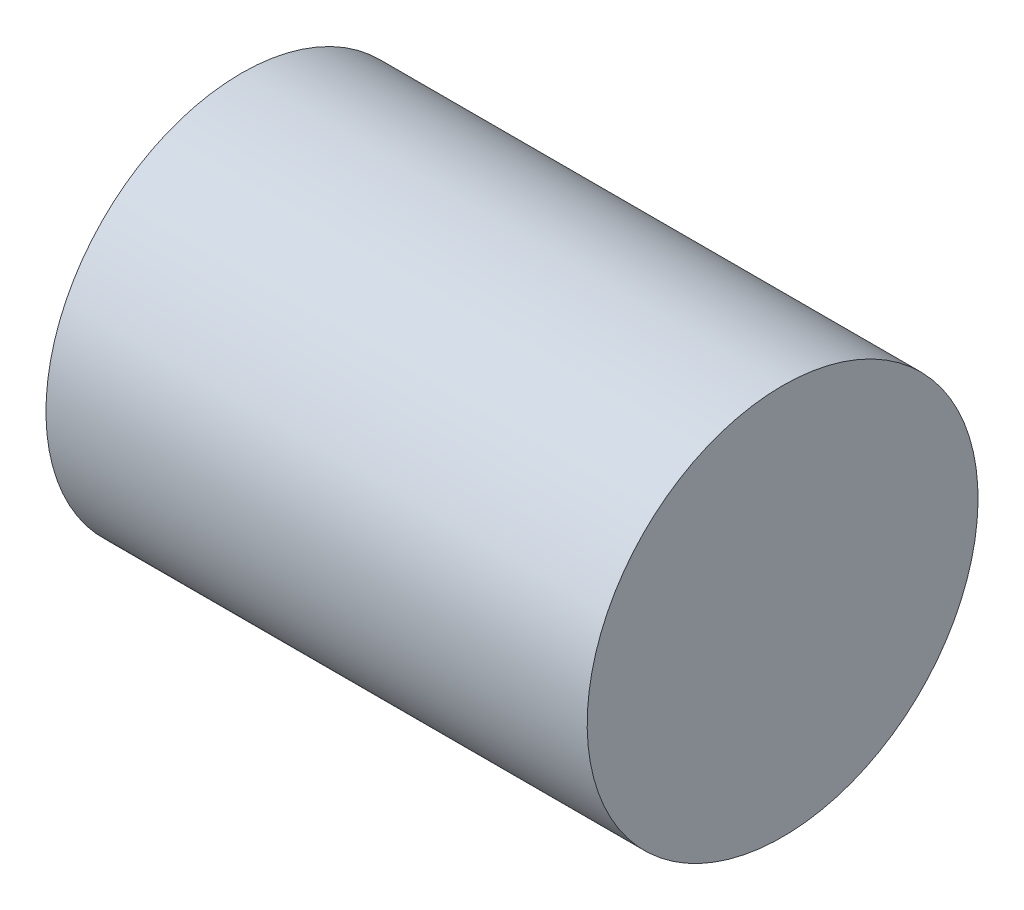
ISO-10303-21;
HEADER;
FILE_DESCRIPTION(('STEP AP214'),'2;1');
FILE_NAME('part.step','',(''),(''),'','','');
FILE_SCHEMA(('AUTOMOTIVE_DESIGN { 1 0 10303 214 1 1 1 1 }'));
ENDSEC;
DATA;
#1=APPLICATION_CONTEXT('core data for automotive mechanical design processes');
#2=APPLICATION_PROTOCOL_DEFINITION('international standard','automotive_design',2000,#1);
#3=PRODUCT_CONTEXT('',#1,'mechanical');
#4=PRODUCT('Part','Part','',(#3));
#5=PRODUCT_RELATED_PRODUCT_CATEGORY('part','',(#4));
#6=PRODUCT_DEFINITION_FORMATION('','',#4);
#7=PRODUCT_DEFINITION_CONTEXT('part definition',#1,'design');
#8=PRODUCT_DEFINITION('design','',#6,#7);
#9=PRODUCT_DEFINITION_SHAPE('','',#8);
#10=(LENGTH_UNIT() NAMED_UNIT(*) SI_UNIT(.MILLI.,.METRE.));
#11=(NAMED_UNIT(*) PLANE_ANGLE_UNIT() SI_UNIT($,.RADIAN.));
#12=(NAMED_UNIT(*) SI_UNIT($,.STERADIAN.) SOLID_ANGLE_UNIT());
#13=UNCERTAINTY_MEASURE_WITH_UNIT(LENGTH_MEASURE(1.E-05),#10,'distance_accuracy_value','');
#14=(GEOMETRIC_REPRESENTATION_CONTEXT(3) GLOBAL_UNCERTAINTY_ASSIGNED_CONTEXT((#13)) GLOBAL_UNIT_ASSIGNED_CONTEXT((#10,
#11,#12)) REPRESENTATION_CONTEXT('',''));
#15=CARTESIAN_POINT('',(0.,0.,0.));
#16=DIRECTION('',(0.,0.,1.));
#17=DIRECTION('',(1.,0.,0.));
#18=AXIS2_PLACEMENT_3D('',#15,#16,#17);
#19=CARTESIAN_POINT('',(0.,0.,0.));
#20=DIRECTION('',(-1.,0.,0.));
#21=DIRECTION('',(0.,-1.,0.));
#22=AXIS2_PLACEMENT_3D('',#19,#20,#21);
#23=PLANE('',#22);
#24=CARTESIAN_POINT('',(0.,0.,0.));
#25=DIRECTION('',(1.,0.,0.));
#26=DIRECTION('',(0.,1.,0.));
#27=AXIS2_PLACEMENT_3D('',#24,#25,#26);
#28=CIRCLE('',#27,65.);
#29=CARTESIAN_POINT('',(0.,65.,0.));
#30=VERTEX_POINT('',#29);
#31=EDGE_CURVE('E10',#30,#30,#28,.T.);
#32=ORIENTED_EDGE('',*,*,#31,.F.);
#33=EDGE_LOOP('',(#32));
#34=FACE_BOUND('',#33,.T.);
#35=ADVANCED_FACE('F37',(#34),#23,.T.);
#36=CARTESIAN_POINT('',(180.,0.,0.));
#37=DIRECTION('',(1.,0.,0.));
#38=DIRECTION('',(0.,1.,0.));
#39=AXIS2_PLACEMENT_3D('',#36,#37,#38);
#40=CYLINDRICAL_SURFACE('',#39,65.);
#41=ORIENTED_EDGE('',*,*,#31,.T.);
#42=EDGE_LOOP('',(#41));
#43=FACE_BOUND('',#42,.T.);
#44=CARTESIAN_POINT('',(180.,0.,0.));
#45=DIRECTION('',(1.,0.,0.));
#46=DIRECTION('',(0.,1.,0.));
#47=AXIS2_PLACEMENT_3D('',#44,#45,#46);
#48=CIRCLE('',#47,65.);
#49=CARTESIAN_POINT('',(180.,65.,0.));
#50=VERTEX_POINT('',#49);
#51=EDGE_CURVE('E44',#50,#50,#48,.T.);
#52=ORIENTED_EDGE('',*,*,#51,.F.);
#53=EDGE_LOOP('',(#52));
#54=FACE_BOUND('',#53,.T.);
#55=ADVANCED_FACE('F53',(#43,#54),#40,.T.);
#56=CARTESIAN_POINT('',(180.,65.,0.));
#57=DIRECTION('',(1.,0.,0.));
#58=DIRECTION('',(0.,1.,0.));
#59=AXIS2_PLACEMENT_3D('',#56,#57,#58);
#60=PLANE('',#59);
#61=ORIENTED_EDGE('',*,*,#51,.T.);
#62=EDGE_LOOP('',(#61));
#63=FACE_BOUND('',#62,.T.);
#64=ADVANCED_FACE('F51',(#63),#60,.T.);
#65=CLOSED_SHELL('',(#35,#55,#64));
#66=MANIFOLD_SOLID_BREP('B2',#65);
#67=ADVANCED_BREP_SHAPE_REPRESENTATION('',(#18,#66),#14);
#68=SHAPE_DEFINITION_REPRESENTATION(#9,#67);
ENDSEC;
END-ISO-10303-21;
